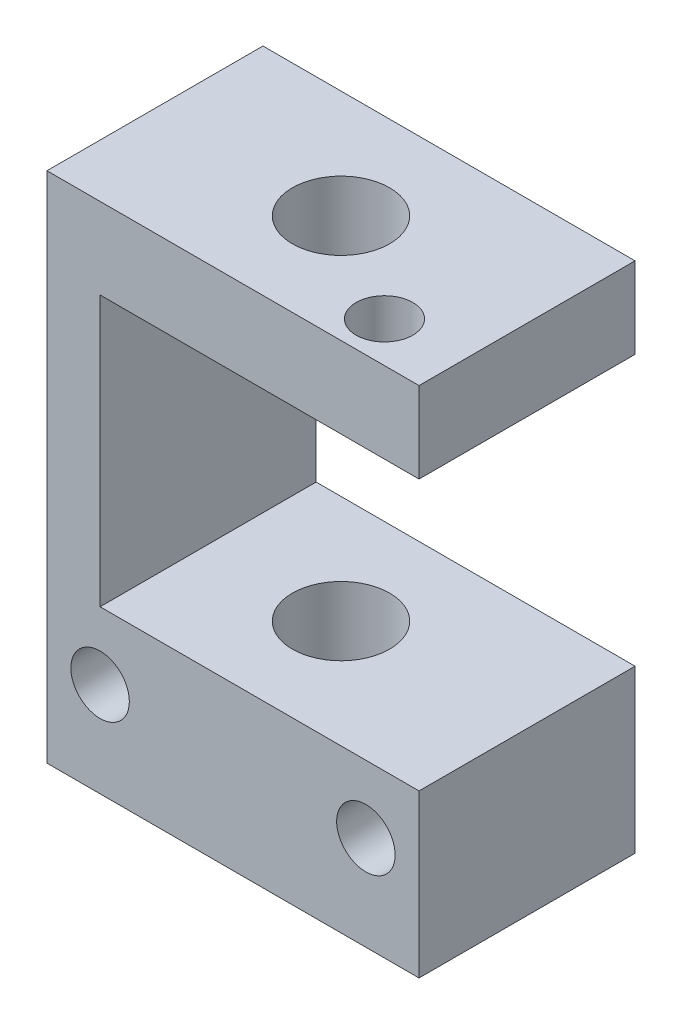
ISO-10303-21;
HEADER;
FILE_DESCRIPTION(('STEP AP214'),'2;1');
FILE_NAME('part.step','',(''),(''),'','','');
FILE_SCHEMA(('AUTOMOTIVE_DESIGN { 1 0 10303 214 1 1 1 1 }'));
ENDSEC;
DATA;
#1=APPLICATION_CONTEXT('core data for automotive mechanical design processes');
#2=APPLICATION_PROTOCOL_DEFINITION('international standard','automotive_design',2000,#1);
#3=PRODUCT_CONTEXT('',#1,'mechanical');
#4=PRODUCT('Part','Part','',(#3));
#5=PRODUCT_RELATED_PRODUCT_CATEGORY('part','',(#4));
#6=PRODUCT_DEFINITION_FORMATION('','',#4);
#7=PRODUCT_DEFINITION_CONTEXT('part definition',#1,'design');
#8=PRODUCT_DEFINITION('design','',#6,#7);
#9=PRODUCT_DEFINITION_SHAPE('','',#8);
#10=(LENGTH_UNIT() NAMED_UNIT(*) SI_UNIT(.MILLI.,.METRE.));
#11=(NAMED_UNIT(*) PLANE_ANGLE_UNIT() SI_UNIT($,.RADIAN.));
#12=(NAMED_UNIT(*) SI_UNIT($,.STERADIAN.) SOLID_ANGLE_UNIT());
#13=UNCERTAINTY_MEASURE_WITH_UNIT(LENGTH_MEASURE(1.E-05),#10,'distance_accuracy_value','');
#14=(GEOMETRIC_REPRESENTATION_CONTEXT(3) GLOBAL_UNCERTAINTY_ASSIGNED_CONTEXT((#13)) GLOBAL_UNIT_ASSIGNED_CONTEXT((#10,
#11,#12)) REPRESENTATION_CONTEXT('',''));
#15=CARTESIAN_POINT('',(0.,0.,0.));
#16=DIRECTION('',(0.,0.,1.));
#17=DIRECTION('',(1.,0.,0.));
#18=AXIS2_PLACEMENT_3D('',#15,#16,#17);
#19=CARTESIAN_POINT('',(35.,48.26,0.));
#20=DIRECTION('',(-1.,0.,0.));
#21=DIRECTION('',(0.,0.,1.));
#22=AXIS2_PLACEMENT_3D('',#19,#20,#21);
#23=PLANE('',#22);
#24=DIRECTION('',(0.,-1.,0.));
#25=VECTOR('',#24,1.);
#26=CARTESIAN_POINT('',(35.,48.26,0.));
#27=LINE('',#26,#25);
#28=CARTESIAN_POINT('',(35.,48.26,0.));
#29=VERTEX_POINT('',#28);
#30=CARTESIAN_POINT('',(35.,40.64,0.));
#31=VERTEX_POINT('',#30);
#32=EDGE_CURVE('E42',#29,#31,#27,.T.);
#33=ORIENTED_EDGE('',*,*,#32,.T.);
#34=DIRECTION('',(0.,0.,-1.));
#35=VECTOR('',#34,1.);
#36=CARTESIAN_POINT('',(35.,40.64,0.));
#37=LINE('',#36,#35);
#38=CARTESIAN_POINT('',(35.,40.64,-20.32));
#39=VERTEX_POINT('',#38);
#40=EDGE_CURVE('E136',#31,#39,#37,.T.);
#41=ORIENTED_EDGE('',*,*,#40,.T.);
#42=DIRECTION('',(0.,-1.,0.));
#43=VECTOR('',#42,1.);
#44=CARTESIAN_POINT('',(35.,48.26,-20.32));
#45=LINE('',#44,#43);
#46=CARTESIAN_POINT('',(35.,48.26,-20.32));
#47=VERTEX_POINT('',#46);
#48=EDGE_CURVE('E128',#47,#39,#45,.T.);
#49=ORIENTED_EDGE('',*,*,#48,.F.);
#50=DIRECTION('',(0.,0.,-1.));
#51=VECTOR('',#50,1.);
#52=CARTESIAN_POINT('',(35.,48.26,0.));
#53=LINE('',#52,#51);
#54=EDGE_CURVE('E178',#29,#47,#53,.T.);
#55=ORIENTED_EDGE('',*,*,#54,.F.);
#56=EDGE_LOOP('',(#33,#41,#49,#55));
#57=FACE_BOUND('',#56,.T.);
#58=ADVANCED_FACE('F33',(#57),#23,.F.);
#59=CARTESIAN_POINT('',(17.5,48.26,-10.16));
#60=DIRECTION('',(0.,-1.,0.));
#61=DIRECTION('',(0.,0.,-1.));
#62=AXIS2_PLACEMENT_3D('',#59,#60,#61);
#63=CYLINDRICAL_SURFACE('',#62,4.572);
#64=CARTESIAN_POINT('',(17.5,40.64,-10.16));
#65=DIRECTION('',(0.,1.,0.));
#66=DIRECTION('',(0.,0.,1.));
#67=AXIS2_PLACEMENT_3D('',#64,#65,#66);
#68=CIRCLE('',#67,4.572);
#69=CARTESIAN_POINT('',(17.5,40.64,-14.732));
#70=VERTEX_POINT('',#69);
#71=EDGE_CURVE('E37',#70,#70,#68,.T.);
#72=CARTESIAN_POINT('',(17.5,48.26,-10.16));
#73=DIRECTION('',(0.,1.,0.));
#74=DIRECTION('',(0.,0.,1.));
#75=AXIS2_PLACEMENT_3D('',#72,#73,#74);
#76=CIRCLE('',#75,4.572);
#77=CARTESIAN_POINT('',(17.5,48.26,-14.732));
#78=VERTEX_POINT('',#77);
#79=EDGE_CURVE('E169',#78,#78,#76,.T.);
#80=CARTESIAN_POINT('',(17.5,40.64,-14.732));
#81=CARTESIAN_POINT('',(17.5,40.719375,-14.732));
#82=CARTESIAN_POINT('',(17.5,40.79875,-14.732));
#83=CARTESIAN_POINT('',(17.5,40.9575,-14.732));
#84=CARTESIAN_POINT('',(17.5,41.036875,-14.732));
#85=CARTESIAN_POINT('',(17.5,41.195625,-14.732));
#86=CARTESIAN_POINT('',(17.5,41.275,-14.732));
#87=CARTESIAN_POINT('',(17.5,41.43375,-14.732));
#88=CARTESIAN_POINT('',(17.5,41.513125,-14.732));
#89=CARTESIAN_POINT('',(17.5,41.671875,-14.732));
#90=CARTESIAN_POINT('',(17.5,41.75125,-14.732));
#91=CARTESIAN_POINT('',(17.5,41.91,-14.732));
#92=CARTESIAN_POINT('',(17.5,41.989375,-14.732));
#93=CARTESIAN_POINT('',(17.5,42.148125,-14.732));
#94=CARTESIAN_POINT('',(17.5,42.2275,-14.732));
#95=CARTESIAN_POINT('',(17.5,42.38625,-14.732));
#96=CARTESIAN_POINT('',(17.5,42.465625,-14.732));
#97=CARTESIAN_POINT('',(17.5,42.624375,-14.732));
#98=CARTESIAN_POINT('',(17.5,42.70375,-14.732));
#99=CARTESIAN_POINT('',(17.5,42.8625,-14.732));
#100=CARTESIAN_POINT('',(17.5,42.941875,-14.732));
#101=CARTESIAN_POINT('',(17.5,43.100625,-14.732));
#102=CARTESIAN_POINT('',(17.5,43.18,-14.732));
#103=CARTESIAN_POINT('',(17.5,43.33875,-14.732));
#104=CARTESIAN_POINT('',(17.5,43.418125,-14.732));
#105=CARTESIAN_POINT('',(17.5,43.576875,-14.732));
#106=CARTESIAN_POINT('',(17.5,43.65625,-14.732));
#107=CARTESIAN_POINT('',(17.5,43.815,-14.732));
#108=CARTESIAN_POINT('',(17.5,43.894375,-14.732));
#109=CARTESIAN_POINT('',(17.5,44.053125,-14.732));
#110=CARTESIAN_POINT('',(17.5,44.1325,-14.732));
#111=CARTESIAN_POINT('',(17.5,44.29125,-14.732));
#112=CARTESIAN_POINT('',(17.5,44.370625,-14.732));
#113=CARTESIAN_POINT('',(17.5,44.529375,-14.732));
#114=CARTESIAN_POINT('',(17.5,44.60875,-14.732));
#115=CARTESIAN_POINT('',(17.5,44.7675,-14.732));
#116=CARTESIAN_POINT('',(17.5,44.846875,-14.732));
#117=CARTESIAN_POINT('',(17.5,45.005625,-14.732));
#118=CARTESIAN_POINT('',(17.5,45.085,-14.732));
#119=CARTESIAN_POINT('',(17.5,45.24375,-14.732));
#120=CARTESIAN_POINT('',(17.5,45.323125,-14.732));
#121=CARTESIAN_POINT('',(17.5,45.481875,-14.732));
#122=CARTESIAN_POINT('',(17.5,45.56125,-14.732));
#123=CARTESIAN_POINT('',(17.5,45.72,-14.732));
#124=CARTESIAN_POINT('',(17.5,45.799375,-14.732));
#125=CARTESIAN_POINT('',(17.5,45.958125,-14.732));
#126=CARTESIAN_POINT('',(17.5,46.0375,-14.732));
#127=CARTESIAN_POINT('',(17.5,46.19625,-14.732));
#128=CARTESIAN_POINT('',(17.5,46.275625,-14.732));
#129=CARTESIAN_POINT('',(17.5,46.434375,-14.732));
#130=CARTESIAN_POINT('',(17.5,46.51375,-14.732));
#131=CARTESIAN_POINT('',(17.5,46.6725,-14.732));
#132=CARTESIAN_POINT('',(17.5,46.751875,-14.732));
#133=CARTESIAN_POINT('',(17.5,46.910625,-14.732));
#134=CARTESIAN_POINT('',(17.5,46.99,-14.732));
#135=CARTESIAN_POINT('',(17.5,47.14875,-14.732));
#136=CARTESIAN_POINT('',(17.5,47.228125,-14.732));
#137=CARTESIAN_POINT('',(17.5,47.386875,-14.732));
#138=CARTESIAN_POINT('',(17.5,47.46625,-14.732));
#139=CARTESIAN_POINT('',(17.5,47.625,-14.732));
#140=CARTESIAN_POINT('',(17.5,47.704375,-14.732));
#141=CARTESIAN_POINT('',(17.5,47.863125,-14.732));
#142=CARTESIAN_POINT('',(17.5,47.9425,-14.732));
#143=CARTESIAN_POINT('',(17.5,48.10125,-14.732));
#144=CARTESIAN_POINT('',(17.5,48.180625,-14.732));
#145=CARTESIAN_POINT('',(17.5,48.26,-14.732));
#146=B_SPLINE_CURVE_WITH_KNOTS('',3,(#80,#81,#82,#83,#84,#85,#86,#87,#88,#89,#90,#91,#92,#93,
#94,#95,#96,#97,#98,#99,#100,#101,#102,#103,#104,#105,#106,#107,#108,#109,#110,#111,#112,#113,
#114,#115,#116,#117,#118,#119,#120,#121,#122,#123,#124,#125,#126,#127,#128,#129,#130,#131,#132,
#133,#134,#135,#136,#137,#138,#139,#140,#141,#142,#143,#144,#145),.UNSPECIFIED.,.F.,.F.,(4,2,2,
2,2,2,2,2,2,2,2,2,2,2,2,2,2,2,2,2,2,2,2,2,2,2,2,2,2,2,2,2,4),(0.,0.238125000000006,
0.476250000000004,0.714375000000003,0.952500000000002,1.190625,1.42875000000001,
1.66687500000001,1.905,2.143125,2.38125,2.619375,2.85750000000001,3.095625,3.33375,3.571875,
3.81,4.04812500000001,4.28625000000001,4.524375,4.7625,5.000625,5.23875000000001,
5.47687500000001,5.71500000000001,5.953125,6.19125,6.42937500000001,6.66750000000001,
6.90562500000001,7.14375,7.381875,7.62000000000001),.UNSPECIFIED.);
#147=EDGE_CURVE('BSEAM225',#70,#78,#146,.T.);
#148=ORIENTED_EDGE('',*,*,#71,.F.);
#149=ORIENTED_EDGE('',*,*,#79,.T.);
#150=ORIENTED_EDGE('',*,*,#147,.T.);
#151=ORIENTED_EDGE('',*,*,#147,.F.);
#152=EDGE_LOOP('',(#148,#150,#149,#151));
#153=FACE_BOUND('',#152,.T.);
#154=ADVANCED_FACE('F225',(#153),#63,.F.);
#155=CARTESIAN_POINT('',(0.,48.26,0.));
#156=DIRECTION('',(0.,-1.,0.));
#157=DIRECTION('',(0.,0.,-1.));
#158=AXIS2_PLACEMENT_3D('',#155,#156,#157);
#159=PLANE('',#158);
#160=CARTESIAN_POINT('',(27.94,48.26,-3.81));
#161=DIRECTION('',(0.,1.,0.));
#162=DIRECTION('',(0.,0.,1.));
#163=AXIS2_PLACEMENT_3D('',#160,#161,#162);
#164=CIRCLE('',#163,2.667);
#165=CARTESIAN_POINT('',(27.94,48.26,-1.143));
#166=VERTEX_POINT('',#165);
#167=EDGE_CURVE('E140',#166,#166,#164,.T.);
#168=ORIENTED_EDGE('',*,*,#167,.F.);
#169=EDGE_LOOP('',(#168));
#170=FACE_BOUND('',#169,.T.);
#171=DIRECTION('',(0.,0.,1.));
#172=VECTOR('',#171,1.);
#173=CARTESIAN_POINT('',(0.,48.26,0.));
#174=LINE('',#173,#172);
#175=CARTESIAN_POINT('',(0.,48.26,-20.32));
#176=VERTEX_POINT('',#175);
#177=CARTESIAN_POINT('',(0.,48.26,0.));
#178=VERTEX_POINT('',#177);
#179=EDGE_CURVE('E175',#176,#178,#174,.T.);
#180=ORIENTED_EDGE('',*,*,#179,.T.);
#181=DIRECTION('',(1.,0.,0.));
#182=VECTOR('',#181,1.);
#183=CARTESIAN_POINT('',(0.,48.26,0.));
#184=LINE('',#183,#182);
#185=EDGE_CURVE('E86',#178,#29,#184,.T.);
#186=ORIENTED_EDGE('',*,*,#185,.T.);
#187=ORIENTED_EDGE('',*,*,#54,.T.);
#188=DIRECTION('',(-1.,0.,0.));
#189=VECTOR('',#188,1.);
#190=CARTESIAN_POINT('',(0.,48.26,-20.32));
#191=LINE('',#190,#189);
#192=EDGE_CURVE('E59',#47,#176,#191,.T.);
#193=ORIENTED_EDGE('',*,*,#192,.T.);
#194=EDGE_LOOP('',(#180,#186,#187,#193));
#195=FACE_BOUND('',#194,.T.);
#196=ORIENTED_EDGE('',*,*,#79,.F.);
#197=EDGE_LOOP('',(#196));
#198=FACE_BOUND('',#197,.T.);
#199=ADVANCED_FACE('F197',(#170,#195,#198),#159,.F.);
#200=CARTESIAN_POINT('',(0.,0.,0.));
#201=DIRECTION('',(0.,-1.,0.));
#202=DIRECTION('',(0.,0.,-1.));
#203=AXIS2_PLACEMENT_3D('',#200,#201,#202);
#204=PLANE('',#203);
#205=DIRECTION('',(0.,0.,1.));
#206=VECTOR('',#205,1.);
#207=CARTESIAN_POINT('',(0.,0.,0.));
#208=LINE('',#207,#206);
#209=CARTESIAN_POINT('',(0.,0.,-20.32));
#210=VERTEX_POINT('',#209);
#211=CARTESIAN_POINT('',(0.,0.,0.));
#212=VERTEX_POINT('',#211);
#213=EDGE_CURVE('E172',#210,#212,#208,.T.);
#214=ORIENTED_EDGE('',*,*,#213,.F.);
#215=DIRECTION('',(-1.,0.,0.));
#216=VECTOR('',#215,1.);
#217=CARTESIAN_POINT('',(0.,0.,-20.32));
#218=LINE('',#217,#216);
#219=CARTESIAN_POINT('',(35.,0.,-20.32));
#220=VERTEX_POINT('',#219);
#221=EDGE_CURVE('E79',#220,#210,#218,.T.);
#222=ORIENTED_EDGE('',*,*,#221,.F.);
#223=DIRECTION('',(0.,0.,-1.));
#224=VECTOR('',#223,1.);
#225=CARTESIAN_POINT('',(35.,0.,0.));
#226=LINE('',#225,#224);
#227=CARTESIAN_POINT('',(35.,0.,0.));
#228=VERTEX_POINT('',#227);
#229=EDGE_CURVE('E185',#228,#220,#226,.T.);
#230=ORIENTED_EDGE('',*,*,#229,.F.);
#231=DIRECTION('',(1.,0.,0.));
#232=VECTOR('',#231,1.);
#233=CARTESIAN_POINT('',(0.,0.,0.));
#234=LINE('',#233,#232);
#235=EDGE_CURVE('E126',#212,#228,#234,.T.);
#236=ORIENTED_EDGE('',*,*,#235,.F.);
#237=EDGE_LOOP('',(#214,#222,#230,#236));
#238=FACE_BOUND('',#237,.T.);
#239=CARTESIAN_POINT('',(17.5,0.,-10.16));
#240=DIRECTION('',(0.,1.,0.));
#241=DIRECTION('',(0.,0.,1.));
#242=AXIS2_PLACEMENT_3D('',#239,#240,#241);
#243=CIRCLE('',#242,4.572);
#244=CARTESIAN_POINT('',(17.5,0.,-14.732));
#245=VERTEX_POINT('',#244);
#246=EDGE_CURVE('E168',#245,#245,#243,.T.);
#247=ORIENTED_EDGE('',*,*,#246,.T.);
#248=EDGE_LOOP('',(#247));
#249=FACE_BOUND('',#248,.T.);
#250=ADVANCED_FACE('F194',(#238,#249),#204,.T.);
#251=CARTESIAN_POINT('',(0.,48.26,0.));
#252=DIRECTION('',(1.,0.,0.));
#253=DIRECTION('',(0.,0.,-1.));
#254=AXIS2_PLACEMENT_3D('',#251,#252,#253);
#255=PLANE('',#254);
#256=ORIENTED_EDGE('',*,*,#213,.T.);
#257=DIRECTION('',(0.,-1.,0.));
#258=VECTOR('',#257,1.);
#259=CARTESIAN_POINT('',(0.,48.26,0.));
#260=LINE('',#259,#258);
#261=EDGE_CURVE('E11',#178,#212,#260,.T.);
#262=ORIENTED_EDGE('',*,*,#261,.F.);
#263=ORIENTED_EDGE('',*,*,#179,.F.);
#264=DIRECTION('',(0.,-1.,0.));
#265=VECTOR('',#264,1.);
#266=CARTESIAN_POINT('',(0.,48.26,-20.32));
#267=LINE('',#266,#265);
#268=EDGE_CURVE('E181',#176,#210,#267,.T.);
#269=ORIENTED_EDGE('',*,*,#268,.T.);
#270=EDGE_LOOP('',(#256,#262,#263,#269));
#271=FACE_BOUND('',#270,.T.);
#272=ADVANCED_FACE('F35',(#271),#255,.F.);
#273=CARTESIAN_POINT('',(0.,48.26,0.));
#274=DIRECTION('',(0.,0.,-1.));
#275=DIRECTION('',(-1.,0.,0.));
#276=AXIS2_PLACEMENT_3D('',#273,#274,#275);
#277=PLANE('',#276);
#278=CARTESIAN_POINT('',(5.,8.89,0.));
#279=DIRECTION('',(0.,0.,1.));
#280=DIRECTION('',(1.,0.,0.));
#281=AXIS2_PLACEMENT_3D('',#278,#279,#280);
#282=CIRCLE('',#281,2.75);
#283=CARTESIAN_POINT('',(7.75,8.89,0.));
#284=VERTEX_POINT('',#283);
#285=EDGE_CURVE('E154',#284,#284,#282,.T.);
#286=ORIENTED_EDGE('',*,*,#285,.F.);
#287=EDGE_LOOP('',(#286));
#288=FACE_BOUND('',#287,.T.);
#289=CARTESIAN_POINT('',(30.,8.89,0.));
#290=DIRECTION('',(0.,0.,1.));
#291=DIRECTION('',(1.,0.,0.));
#292=AXIS2_PLACEMENT_3D('',#289,#290,#291);
#293=CIRCLE('',#292,2.75);
#294=CARTESIAN_POINT('',(32.75,8.89,0.));
#295=VERTEX_POINT('',#294);
#296=EDGE_CURVE('E162',#295,#295,#293,.T.);
#297=ORIENTED_EDGE('',*,*,#296,.F.);
#298=EDGE_LOOP('',(#297));
#299=FACE_BOUND('',#298,.T.);
#300=DIRECTION('',(0.,1.,0.));
#301=VECTOR('',#300,1.);
#302=CARTESIAN_POINT('',(5.,40.64,0.));
#303=LINE('',#302,#301);
#304=CARTESIAN_POINT('',(5.,15.24,0.));
#305=VERTEX_POINT('',#304);
#306=CARTESIAN_POINT('',(5.,40.64,0.));
#307=VERTEX_POINT('',#306);
#308=EDGE_CURVE('E113',#305,#307,#303,.T.);
#309=ORIENTED_EDGE('',*,*,#308,.T.);
#310=DIRECTION('',(1.,0.,0.));
#311=VECTOR('',#310,1.);
#312=CARTESIAN_POINT('',(35.,40.64,0.));
#313=LINE('',#312,#311);
#314=EDGE_CURVE('E123',#307,#31,#313,.T.);
#315=ORIENTED_EDGE('',*,*,#314,.T.);
#316=ORIENTED_EDGE('',*,*,#32,.F.);
#317=ORIENTED_EDGE('',*,*,#185,.F.);
#318=ORIENTED_EDGE('',*,*,#261,.T.);
#319=ORIENTED_EDGE('',*,*,#235,.T.);
#320=CARTESIAN_POINT('',(35.,15.24,0.));
#321=VERTEX_POINT('',#320);
#322=EDGE_CURVE('E120',#321,#228,#27,.T.);
#323=ORIENTED_EDGE('',*,*,#322,.F.);
#324=DIRECTION('',(-1.,0.,0.));
#325=VECTOR('',#324,1.);
#326=CARTESIAN_POINT('',(35.,15.24,0.));
#327=LINE('',#326,#325);
#328=EDGE_CURVE('E107',#321,#305,#327,.T.);
#329=ORIENTED_EDGE('',*,*,#328,.T.);
#330=EDGE_LOOP('',(#309,#315,#316,#317,#318,#319,#323,#329));
#331=FACE_BOUND('',#330,.T.);
#332=ADVANCED_FACE('F125',(#288,#299,#331),#277,.F.);
#333=CARTESIAN_POINT('',(35.,15.24,-20.32));
#334=VERTEX_POINT('',#333);
#335=EDGE_CURVE('E122',#334,#220,#45,.T.);
#336=ORIENTED_EDGE('',*,*,#335,.F.);
#337=DIRECTION('',(0.,0.,-1.));
#338=VECTOR('',#337,1.);
#339=CARTESIAN_POINT('',(35.,15.24,0.));
#340=LINE('',#339,#338);
#341=EDGE_CURVE('E50',#321,#334,#340,.T.);
#342=ORIENTED_EDGE('',*,*,#341,.F.);
#343=ORIENTED_EDGE('',*,*,#322,.T.);
#344=ORIENTED_EDGE('',*,*,#229,.T.);
#345=EDGE_LOOP('',(#336,#342,#343,#344));
#346=FACE_BOUND('',#345,.T.);
#347=ADVANCED_FACE('F118',(#346),#23,.F.);
#348=CARTESIAN_POINT('',(0.,48.26,-20.32));
#349=DIRECTION('',(0.,0.,1.));
#350=DIRECTION('',(1.,0.,0.));
#351=AXIS2_PLACEMENT_3D('',#348,#349,#350);
#352=PLANE('',#351);
#353=CARTESIAN_POINT('',(5.,8.89,-20.32));
#354=DIRECTION('',(0.,0.,1.));
#355=DIRECTION('',(1.,0.,0.));
#356=AXIS2_PLACEMENT_3D('',#353,#354,#355);
#357=CIRCLE('',#356,2.75);
#358=CARTESIAN_POINT('',(7.75,8.89,-20.32));
#359=VERTEX_POINT('',#358);
#360=EDGE_CURVE('E159',#359,#359,#357,.T.);
#361=ORIENTED_EDGE('',*,*,#360,.T.);
#362=EDGE_LOOP('',(#361));
#363=FACE_BOUND('',#362,.T.);
#364=CARTESIAN_POINT('',(30.,8.89,-20.32));
#365=DIRECTION('',(0.,0.,1.));
#366=DIRECTION('',(1.,0.,0.));
#367=AXIS2_PLACEMENT_3D('',#364,#365,#366);
#368=CIRCLE('',#367,2.74999999999999);
#369=CARTESIAN_POINT('',(32.75,8.89,-20.32));
#370=VERTEX_POINT('',#369);
#371=EDGE_CURVE('E165',#370,#370,#368,.T.);
#372=ORIENTED_EDGE('',*,*,#371,.T.);
#373=EDGE_LOOP('',(#372));
#374=FACE_BOUND('',#373,.T.);
#375=ORIENTED_EDGE('',*,*,#48,.T.);
#376=DIRECTION('',(1.,0.,0.));
#377=VECTOR('',#376,1.);
#378=CARTESIAN_POINT('',(35.,40.64,-20.32));
#379=LINE('',#378,#377);
#380=CARTESIAN_POINT('',(5.,40.64,-20.32));
#381=VERTEX_POINT('',#380);
#382=EDGE_CURVE('E114',#381,#39,#379,.T.);
#383=ORIENTED_EDGE('',*,*,#382,.F.);
#384=DIRECTION('',(0.,1.,0.));
#385=VECTOR('',#384,1.);
#386=CARTESIAN_POINT('',(5.,40.64,-20.32));
#387=LINE('',#386,#385);
#388=CARTESIAN_POINT('',(5.,15.24,-20.32));
#389=VERTEX_POINT('',#388);
#390=EDGE_CURVE('E204',#389,#381,#387,.T.);
#391=ORIENTED_EDGE('',*,*,#390,.F.);
#392=DIRECTION('',(-1.,0.,0.));
#393=VECTOR('',#392,1.);
#394=CARTESIAN_POINT('',(35.,15.24,-20.32));
#395=LINE('',#394,#393);
#396=EDGE_CURVE('E192',#334,#389,#395,.T.);
#397=ORIENTED_EDGE('',*,*,#396,.F.);
#398=ORIENTED_EDGE('',*,*,#335,.T.);
#399=ORIENTED_EDGE('',*,*,#221,.T.);
#400=ORIENTED_EDGE('',*,*,#268,.F.);
#401=ORIENTED_EDGE('',*,*,#192,.F.);
#402=EDGE_LOOP('',(#375,#383,#391,#397,#398,#399,#400,#401));
#403=FACE_BOUND('',#402,.T.);
#404=ADVANCED_FACE('F190',(#363,#374,#403),#352,.F.);
#405=CARTESIAN_POINT('',(17.5,15.24,-10.16));
#406=DIRECTION('',(0.,-1.,0.));
#407=DIRECTION('',(1.,0.,0.));
#408=AXIS2_PLACEMENT_3D('',#405,#406,#407);
#409=CIRCLE('',#408,4.572);
#410=CARTESIAN_POINT('',(17.5,15.24,-14.732));
#411=VERTEX_POINT('',#410);
#412=EDGE_CURVE('E134',#411,#411,#409,.T.);
#413=CARTESIAN_POINT('',(17.5,15.24,-14.732));
#414=CARTESIAN_POINT('',(17.5,15.08125,-14.732));
#415=CARTESIAN_POINT('',(17.5,14.9225,-14.732));
#416=CARTESIAN_POINT('',(17.5,14.605,-14.732));
#417=CARTESIAN_POINT('',(17.5,14.44625,-14.732));
#418=CARTESIAN_POINT('',(17.5,14.12875,-14.732));
#419=CARTESIAN_POINT('',(17.5,13.97,-14.732));
#420=CARTESIAN_POINT('',(17.5,13.6525,-14.732));
#421=CARTESIAN_POINT('',(17.5,13.49375,-14.732));
#422=CARTESIAN_POINT('',(17.5,13.17625,-14.732));
#423=CARTESIAN_POINT('',(17.5,13.0175,-14.732));
#424=CARTESIAN_POINT('',(17.5,12.7,-14.732));
#425=CARTESIAN_POINT('',(17.5,12.54125,-14.732));
#426=CARTESIAN_POINT('',(17.5,12.22375,-14.732));
#427=CARTESIAN_POINT('',(17.5,12.065,-14.732));
#428=CARTESIAN_POINT('',(17.5,11.7475,-14.732));
#429=CARTESIAN_POINT('',(17.5,11.58875,-14.732));
#430=CARTESIAN_POINT('',(17.5,11.27125,-14.732));
#431=CARTESIAN_POINT('',(17.5,11.1125,-14.732));
#432=CARTESIAN_POINT('',(17.5,10.795,-14.732));
#433=CARTESIAN_POINT('',(17.5,10.63625,-14.732));
#434=CARTESIAN_POINT('',(17.5,10.31875,-14.732));
#435=CARTESIAN_POINT('',(17.5,10.16,-14.732));
#436=CARTESIAN_POINT('',(17.5,9.8425,-14.732));
#437=CARTESIAN_POINT('',(17.5,9.68375,-14.732));
#438=CARTESIAN_POINT('',(17.5,9.36625,-14.732));
#439=CARTESIAN_POINT('',(17.5,9.2075,-14.732));
#440=CARTESIAN_POINT('',(17.5,8.89,-14.732));
#441=CARTESIAN_POINT('',(17.5,8.73125,-14.732));
#442=CARTESIAN_POINT('',(17.5,8.41375,-14.732));
#443=CARTESIAN_POINT('',(17.5,8.25499999999999,-14.732));
#444=CARTESIAN_POINT('',(17.5,7.93749999999999,-14.732));
#445=CARTESIAN_POINT('',(17.5,7.77874999999999,-14.732));
#446=CARTESIAN_POINT('',(17.5,7.46125,-14.732));
#447=CARTESIAN_POINT('',(17.5,7.3025,-14.732));
#448=CARTESIAN_POINT('',(17.5,6.985,-14.732));
#449=CARTESIAN_POINT('',(17.5,6.82624999999999,-14.732));
#450=CARTESIAN_POINT('',(17.5,6.50874999999999,-14.732));
#451=CARTESIAN_POINT('',(17.5,6.34999999999999,-14.732));
#452=CARTESIAN_POINT('',(17.5,6.03249999999999,-14.732));
#453=CARTESIAN_POINT('',(17.5,5.87374999999999,-14.732));
#454=CARTESIAN_POINT('',(17.5,5.55624999999999,-14.732));
#455=CARTESIAN_POINT('',(17.5,5.39749999999999,-14.732));
#456=CARTESIAN_POINT('',(17.5,5.07999999999999,-14.732));
#457=CARTESIAN_POINT('',(17.5,4.92125,-14.732));
#458=CARTESIAN_POINT('',(17.5,4.60375,-14.732));
#459=CARTESIAN_POINT('',(17.5,4.445,-14.732));
#460=CARTESIAN_POINT('',(17.5,4.1275,-14.732));
#461=CARTESIAN_POINT('',(17.5,3.96875,-14.732));
#462=CARTESIAN_POINT('',(17.5,3.65124999999999,-14.732));
#463=CARTESIAN_POINT('',(17.5,3.49249999999999,-14.732));
#464=CARTESIAN_POINT('',(17.5,3.17499999999999,-14.732));
#465=CARTESIAN_POINT('',(17.5,3.01624999999999,-14.732));
#466=CARTESIAN_POINT('',(17.5,2.69874999999999,-14.732));
#467=CARTESIAN_POINT('',(17.5,2.53999999999999,-14.732));
#468=CARTESIAN_POINT('',(17.5,2.2225,-14.732));
#469=CARTESIAN_POINT('',(17.5,2.06375,-14.732));
#470=CARTESIAN_POINT('',(17.5,1.74625,-14.732));
#471=CARTESIAN_POINT('',(17.5,1.58749999999999,-14.732));
#472=CARTESIAN_POINT('',(17.5,1.26999999999999,-14.732));
#473=CARTESIAN_POINT('',(17.5,1.11124999999999,-14.732));
#474=CARTESIAN_POINT('',(17.5,0.793749999999994,-14.732));
#475=CARTESIAN_POINT('',(17.5,0.634999999999992,-14.732));
#476=CARTESIAN_POINT('',(17.5,0.317499999999991,-14.732));
#477=CARTESIAN_POINT('',(17.5,0.158749999999992,-14.732));
#478=CARTESIAN_POINT('',(17.5,0.,-14.732));
#479=B_SPLINE_CURVE_WITH_KNOTS('',3,(#413,#414,#415,#416,#417,#418,#419,#420,#421,#422,#423,
#424,#425,#426,#427,#428,#429,#430,#431,#432,#433,#434,#435,#436,#437,#438,#439,#440,#441,#442,
#443,#444,#445,#446,#447,#448,#449,#450,#451,#452,#453,#454,#455,#456,#457,#458,#459,#460,#461,
#462,#463,#464,#465,#466,#467,#468,#469,#470,#471,#472,#473,#474,#475,#476,#477,#478),
.UNSPECIFIED.,.F.,.F.,(4,2,2,2,2,2,2,2,2,2,2,2,2,2,2,2,2,2,2,2,2,2,2,2,2,2,2,2,2,2,2,2,4),(0.,
0.476249999999998,0.952500000000002,1.42875,1.905,2.38125,2.8575,3.33375,3.81,4.28625,4.7625,
5.23875,5.715,6.19125,6.6675,7.14375,7.62,8.09625,8.5725,9.04875,9.52500000000001,10.00125,
10.4775,10.95375,11.43,11.90625,12.3825,12.85875,13.335,13.81125,14.2875,14.76375,15.24),.UNSPECIFIED.);
#480=EDGE_CURVE('BSEAM232',#411,#245,#479,.T.);
#481=ORIENTED_EDGE('',*,*,#412,.F.);
#482=ORIENTED_EDGE('',*,*,#246,.F.);
#483=ORIENTED_EDGE('',*,*,#480,.T.);
#484=ORIENTED_EDGE('',*,*,#480,.F.);
#485=EDGE_LOOP('',(#481,#483,#482,#484));
#486=FACE_BOUND('',#485,.T.);
#487=ADVANCED_FACE('F232',(#486),#63,.F.);
#488=CARTESIAN_POINT('',(30.,8.89,0.));
#489=DIRECTION('',(0.,0.,1.));
#490=DIRECTION('',(1.,0.,0.));
#491=AXIS2_PLACEMENT_3D('',#488,#489,#490);
#492=CYLINDRICAL_SURFACE('',#491,2.75);
#493=ORIENTED_EDGE('',*,*,#371,.F.);
#494=EDGE_LOOP('',(#493));
#495=FACE_BOUND('',#494,.T.);
#496=ORIENTED_EDGE('',*,*,#296,.T.);
#497=EDGE_LOOP('',(#496));
#498=FACE_BOUND('',#497,.T.);
#499=ADVANCED_FACE('F248',(#495,#498),#492,.F.);
#500=CARTESIAN_POINT('',(5.,8.89,0.));
#501=DIRECTION('',(0.,0.,1.));
#502=DIRECTION('',(1.,0.,0.));
#503=AXIS2_PLACEMENT_3D('',#500,#501,#502);
#504=CYLINDRICAL_SURFACE('',#503,2.75);
#505=ORIENTED_EDGE('',*,*,#360,.F.);
#506=EDGE_LOOP('',(#505));
#507=FACE_BOUND('',#506,.T.);
#508=ORIENTED_EDGE('',*,*,#285,.T.);
#509=EDGE_LOOP('',(#508));
#510=FACE_BOUND('',#509,.T.);
#511=ADVANCED_FACE('F250',(#507,#510),#504,.F.);
#512=CARTESIAN_POINT('',(27.94,43.26,-3.81));
#513=DIRECTION('',(0.,1.,0.));
#514=DIRECTION('',(0.,0.,1.));
#515=AXIS2_PLACEMENT_3D('',#512,#513,#514);
#516=CYLINDRICAL_SURFACE('',#515,2.667);
#517=CARTESIAN_POINT('',(27.94,43.26,-3.81));
#518=DIRECTION('',(0.,1.,0.));
#519=DIRECTION('',(0.,0.,1.));
#520=AXIS2_PLACEMENT_3D('',#517,#518,#519);
#521=CIRCLE('',#520,2.667);
#522=CARTESIAN_POINT('',(27.94,43.26,-1.143));
#523=VERTEX_POINT('',#522);
#524=EDGE_CURVE('E151',#523,#523,#521,.T.);
#525=ORIENTED_EDGE('',*,*,#524,.F.);
#526=EDGE_LOOP('',(#525));
#527=FACE_BOUND('',#526,.T.);
#528=ORIENTED_EDGE('',*,*,#167,.T.);
#529=EDGE_LOOP('',(#528));
#530=FACE_BOUND('',#529,.T.);
#531=ADVANCED_FACE('F221',(#527,#530),#516,.F.);
#532=CARTESIAN_POINT('',(27.94,43.26,-3.81));
#533=DIRECTION('',(0.,1.,0.));
#534=DIRECTION('',(0.,0.,1.));
#535=AXIS2_PLACEMENT_3D('',#532,#533,#534);
#536=PLANE('',#535);
#537=ORIENTED_EDGE('',*,*,#524,.T.);
#538=EDGE_LOOP('',(#537));
#539=FACE_BOUND('',#538,.T.);
#540=ADVANCED_FACE('F213',(#539),#536,.T.);
#541=CARTESIAN_POINT('',(35.,40.64,0.));
#542=DIRECTION('',(0.,1.,0.));
#543=DIRECTION('',(0.,0.,1.));
#544=AXIS2_PLACEMENT_3D('',#541,#542,#543);
#545=PLANE('',#544);
#546=ORIENTED_EDGE('',*,*,#71,.T.);
#547=EDGE_LOOP('',(#546));
#548=FACE_BOUND('',#547,.T.);
#549=ORIENTED_EDGE('',*,*,#382,.T.);
#550=ORIENTED_EDGE('',*,*,#40,.F.);
#551=ORIENTED_EDGE('',*,*,#314,.F.);
#552=DIRECTION('',(0.,0.,-1.));
#553=VECTOR('',#552,1.);
#554=CARTESIAN_POINT('',(5.,40.64,0.));
#555=LINE('',#554,#553);
#556=EDGE_CURVE('E142',#307,#381,#555,.T.);
#557=ORIENTED_EDGE('',*,*,#556,.T.);
#558=EDGE_LOOP('',(#549,#550,#551,#557));
#559=FACE_BOUND('',#558,.T.);
#560=ADVANCED_FACE('F211',(#548,#559),#545,.F.);
#561=CARTESIAN_POINT('',(5.,40.64,0.));
#562=DIRECTION('',(-1.,0.,0.));
#563=DIRECTION('',(0.,-1.,0.));
#564=AXIS2_PLACEMENT_3D('',#561,#562,#563);
#565=PLANE('',#564);
#566=ORIENTED_EDGE('',*,*,#390,.T.);
#567=ORIENTED_EDGE('',*,*,#556,.F.);
#568=ORIENTED_EDGE('',*,*,#308,.F.);
#569=DIRECTION('',(0.,0.,-1.));
#570=VECTOR('',#569,1.);
#571=CARTESIAN_POINT('',(5.,15.24,0.));
#572=LINE('',#571,#570);
#573=EDGE_CURVE('E109',#305,#389,#572,.T.);
#574=ORIENTED_EDGE('',*,*,#573,.T.);
#575=EDGE_LOOP('',(#566,#567,#568,#574));
#576=FACE_BOUND('',#575,.T.);
#577=ADVANCED_FACE('F210',(#576),#565,.F.);
#578=CARTESIAN_POINT('',(35.,15.24,0.));
#579=DIRECTION('',(0.,-1.,0.));
#580=DIRECTION('',(1.,0.,0.));
#581=AXIS2_PLACEMENT_3D('',#578,#579,#580);
#582=PLANE('',#581);
#583=ORIENTED_EDGE('',*,*,#412,.T.);
#584=EDGE_LOOP('',(#583));
#585=FACE_BOUND('',#584,.T.);
#586=ORIENTED_EDGE('',*,*,#396,.T.);
#587=ORIENTED_EDGE('',*,*,#573,.F.);
#588=ORIENTED_EDGE('',*,*,#328,.F.);
#589=ORIENTED_EDGE('',*,*,#341,.T.);
#590=EDGE_LOOP('',(#586,#587,#588,#589));
#591=FACE_BOUND('',#590,.T.);
#592=ADVANCED_FACE('F108',(#585,#591),#582,.F.);
#593=CLOSED_SHELL('',(#58,#154,#199,#250,#272,#332,#347,#404,#487,#499,#511,#531,#540,#560,#577,#592));
#594=MANIFOLD_SOLID_BREP('B2',#593);
#595=ADVANCED_BREP_SHAPE_REPRESENTATION('',(#18,#594),#14);
#596=SHAPE_DEFINITION_REPRESENTATION(#9,#595);
ENDSEC;
END-ISO-10303-21;
